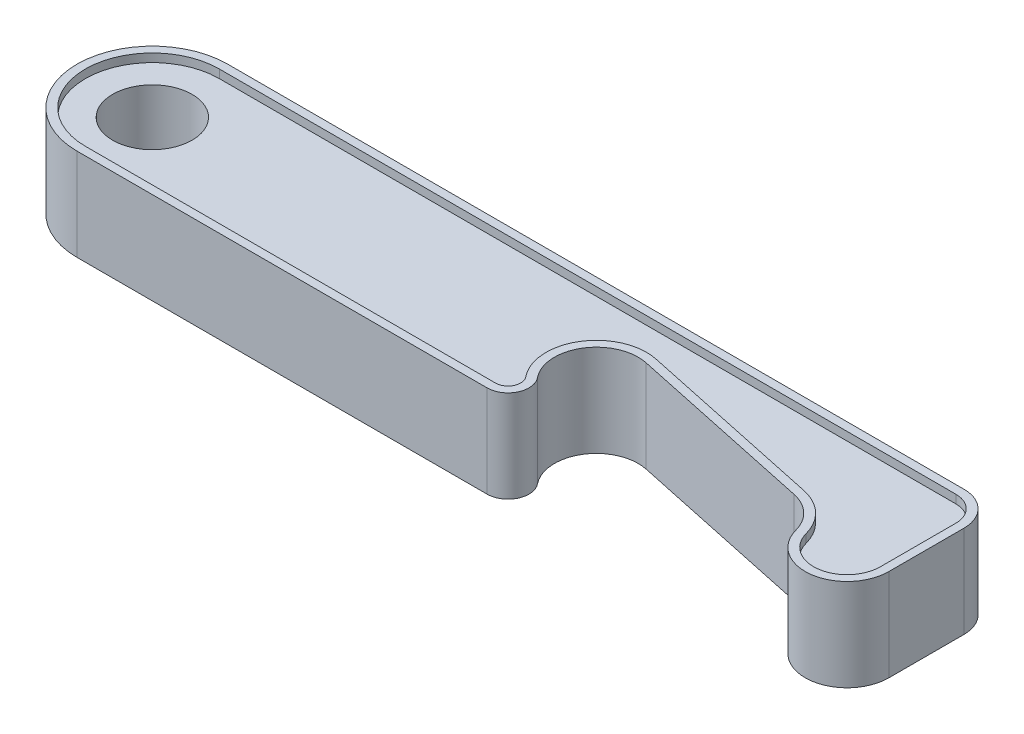
ISO-10303-21;
HEADER;
FILE_DESCRIPTION(('STEP AP214'),'2;1');
FILE_NAME('part.step','',(''),(''),'','','');
FILE_SCHEMA(('AUTOMOTIVE_DESIGN { 1 0 10303 214 1 1 1 1 }'));
ENDSEC;
DATA;
#1=APPLICATION_CONTEXT('core data for automotive mechanical design processes');
#2=APPLICATION_PROTOCOL_DEFINITION('international standard','automotive_design',2000,#1);
#3=PRODUCT_CONTEXT('',#1,'mechanical');
#4=PRODUCT('Part','Part','',(#3));
#5=PRODUCT_RELATED_PRODUCT_CATEGORY('part','',(#4));
#6=PRODUCT_DEFINITION_FORMATION('','',#4);
#7=PRODUCT_DEFINITION_CONTEXT('part definition',#1,'design');
#8=PRODUCT_DEFINITION('design','',#6,#7);
#9=PRODUCT_DEFINITION_SHAPE('','',#8);
#10=(LENGTH_UNIT() NAMED_UNIT(*) SI_UNIT(.MILLI.,.METRE.));
#11=(NAMED_UNIT(*) PLANE_ANGLE_UNIT() SI_UNIT($,.RADIAN.));
#12=(NAMED_UNIT(*) SI_UNIT($,.STERADIAN.) SOLID_ANGLE_UNIT());
#13=UNCERTAINTY_MEASURE_WITH_UNIT(LENGTH_MEASURE(1.E-05),#10,'distance_accuracy_value','');
#14=(GEOMETRIC_REPRESENTATION_CONTEXT(3) GLOBAL_UNCERTAINTY_ASSIGNED_CONTEXT((#13)) GLOBAL_UNIT_ASSIGNED_CONTEXT((#10,
#11,#12)) REPRESENTATION_CONTEXT('',''));
#15=CARTESIAN_POINT('',(0.,0.,0.));
#16=DIRECTION('',(0.,0.,1.));
#17=DIRECTION('',(1.,0.,0.));
#18=AXIS2_PLACEMENT_3D('',#15,#16,#17);
#19=CARTESIAN_POINT('',(0.,4.5,0.));
#20=DIRECTION('',(0.,1.,0.));
#21=DIRECTION('',(0.,0.,1.));
#22=AXIS2_PLACEMENT_3D('',#19,#20,#21);
#23=PLANE('',#22);
#24=CARTESIAN_POINT('',(0.,4.5,0.));
#25=DIRECTION('',(0.,1.,0.));
#26=DIRECTION('',(0.,0.,1.));
#27=AXIS2_PLACEMENT_3D('',#24,#25,#26);
#28=CIRCLE('',#27,4.75);
#29=CARTESIAN_POINT('',(0.,4.5,4.75));
#30=VERTEX_POINT('',#29);
#31=EDGE_CURVE('E352',#30,#30,#28,.T.);
#32=ORIENTED_EDGE('',*,*,#31,.F.);
#33=EDGE_LOOP('',(#32));
#34=FACE_BOUND('',#33,.T.);
#35=CARTESIAN_POINT('',(88.,4.5,-5.));
#36=DIRECTION('',(0.,1.,0.));
#37=DIRECTION('',(0.,0.,1.));
#38=AXIS2_PLACEMENT_3D('',#35,#36,#37);
#39=CIRCLE('',#38,2.99999999999999);
#40=CARTESIAN_POINT('',(91.,4.5,-5.));
#41=VERTEX_POINT('',#40);
#42=CARTESIAN_POINT('',(88.,4.5,-8.));
#43=VERTEX_POINT('',#42);
#44=EDGE_CURVE('E350',#41,#43,#39,.T.);
#45=ORIENTED_EDGE('',*,*,#44,.T.);
#46=DIRECTION('',(-1.,0.,0.));
#47=VECTOR('',#46,1.);
#48=CARTESIAN_POINT('',(0.,4.5,-8.));
#49=LINE('',#48,#47);
#50=CARTESIAN_POINT('',(0.,4.5,-8.));
#51=VERTEX_POINT('',#50);
#52=EDGE_CURVE('E263',#43,#51,#49,.T.);
#53=ORIENTED_EDGE('',*,*,#52,.T.);
#54=CARTESIAN_POINT('',(0.,4.5,0.));
#55=DIRECTION('',(0.,1.,0.));
#56=DIRECTION('',(0.,0.,1.));
#57=AXIS2_PLACEMENT_3D('',#54,#55,#56);
#58=CIRCLE('',#57,8.);
#59=CARTESIAN_POINT('',(0.,4.5,8.));
#60=VERTEX_POINT('',#59);
#61=EDGE_CURVE('E264',#51,#60,#58,.T.);
#62=ORIENTED_EDGE('',*,*,#61,.T.);
#63=DIRECTION('',(1.,0.,0.));
#64=VECTOR('',#63,1.);
#65=CARTESIAN_POINT('',(0.,4.5,8.));
#66=LINE('',#65,#64);
#67=CARTESIAN_POINT('',(49.,4.5,8.));
#68=VERTEX_POINT('',#67);
#69=EDGE_CURVE('E268',#60,#68,#66,.T.);
#70=ORIENTED_EDGE('',*,*,#69,.T.);
#71=CARTESIAN_POINT('',(49.,4.5,6.5));
#72=DIRECTION('',(0.,1.,0.));
#73=DIRECTION('',(0.,0.,1.));
#74=AXIS2_PLACEMENT_3D('',#71,#72,#73);
#75=CIRCLE('',#74,1.5);
#76=CARTESIAN_POINT('',(50.1680412860443,4.5,5.55889450426857));
#77=VERTEX_POINT('',#76);
#78=EDGE_CURVE('E326',#77,#68,#75,.F.);
#79=ORIENTED_EDGE('',*,*,#78,.F.);
#80=CARTESIAN_POINT('',(54.8402064302217,4.5,1.79447252134288));
#81=DIRECTION('',(0.,1.,0.));
#82=DIRECTION('',(0.,0.,1.));
#83=AXIS2_PLACEMENT_3D('',#80,#81,#82);
#84=CIRCLE('',#83,6.);
#85=CARTESIAN_POINT('',(56.0876765751282,4.5,-4.07441308305996));
#86=VERTEX_POINT('',#85);
#87=EDGE_CURVE('E328',#86,#77,#84,.T.);
#88=ORIENTED_EDGE('',*,*,#87,.F.);
#89=DIRECTION('',(-0.978147600733807,0.,-0.207911690817752));
#90=VECTOR('',#89,1.);
#91=CARTESIAN_POINT('',(3.25312375505004,4.5,-15.3047439678686));
#92=LINE('',#91,#90);
#93=CARTESIAN_POINT('',(78.5850713920058,4.5,0.707555805748343));
#94=VERTEX_POINT('',#93);
#95=EDGE_CURVE('E330',#94,#86,#92,.T.);
#96=ORIENTED_EDGE('',*,*,#95,.F.);
#97=CARTESIAN_POINT('',(77.3376012470992,4.5,6.57644141015118));
#98=DIRECTION('',(0.,1.,0.));
#99=DIRECTION('',(0.,0.,1.));
#100=AXIS2_PLACEMENT_3D('',#97,#98,#99);
#101=CIRCLE('',#100,6.);
#102=CARTESIAN_POINT('',(83.1350404988397,4.5,5.03057656406046));
#103=VERTEX_POINT('',#102);
#104=EDGE_CURVE('E422',#103,#94,#101,.T.);
#105=ORIENTED_EDGE('',*,*,#104,.F.);
#106=CARTESIAN_POINT('',(87.,4.5,3.99999999999999));
#107=DIRECTION('',(0.,1.,0.));
#108=DIRECTION('',(0.,0.,1.));
#109=AXIS2_PLACEMENT_3D('',#106,#107,#108);
#110=CIRCLE('',#109,4.);
#111=CARTESIAN_POINT('',(91.,4.5,3.99999999999999));
#112=VERTEX_POINT('',#111);
#113=EDGE_CURVE('E425',#112,#103,#110,.F.);
#114=ORIENTED_EDGE('',*,*,#113,.F.);
#115=DIRECTION('',(0.,0.,1.));
#116=VECTOR('',#115,1.);
#117=CARTESIAN_POINT('',(91.,4.5,-1.40319854501235E-13));
#118=LINE('',#117,#116);
#119=EDGE_CURVE('E426',#41,#112,#118,.T.);
#120=ORIENTED_EDGE('',*,*,#119,.F.);
#121=EDGE_LOOP('',(#45,#53,#62,#70,#79,#88,#96,#105,#114,#120));
#122=FACE_BOUND('',#121,.T.);
#123=ADVANCED_FACE('F41',(#34,#122),#23,.T.);
#124=CARTESIAN_POINT('',(0.,-4.5,0.));
#125=DIRECTION('',(0.,1.,0.));
#126=DIRECTION('',(0.,0.,1.));
#127=AXIS2_PLACEMENT_3D('',#124,#125,#126);
#128=PLANE('',#127);
#129=CARTESIAN_POINT('',(0.,-4.5,0.));
#130=DIRECTION('',(0.,1.,0.));
#131=DIRECTION('',(0.,0.,1.));
#132=AXIS2_PLACEMENT_3D('',#129,#130,#131);
#133=CIRCLE('',#132,4.75);
#134=CARTESIAN_POINT('',(0.,-4.5,4.75));
#135=VERTEX_POINT('',#134);
#136=EDGE_CURVE('E349',#135,#135,#133,.T.);
#137=ORIENTED_EDGE('',*,*,#136,.T.);
#138=EDGE_LOOP('',(#137));
#139=FACE_BOUND('',#138,.T.);
#140=DIRECTION('',(-1.,0.,0.));
#141=VECTOR('',#140,1.);
#142=CARTESIAN_POINT('',(0.,-4.5,-8.));
#143=LINE('',#142,#141);
#144=CARTESIAN_POINT('',(88.,-4.5,-8.));
#145=VERTEX_POINT('',#144);
#146=CARTESIAN_POINT('',(0.,-4.5,-8.));
#147=VERTEX_POINT('',#146);
#148=EDGE_CURVE('E12',#145,#147,#143,.T.);
#149=ORIENTED_EDGE('',*,*,#148,.F.);
#150=CARTESIAN_POINT('',(88.,-4.5,-5.));
#151=DIRECTION('',(0.,1.,0.));
#152=DIRECTION('',(0.,0.,1.));
#153=AXIS2_PLACEMENT_3D('',#150,#151,#152);
#154=CIRCLE('',#153,2.99999999999999);
#155=CARTESIAN_POINT('',(91.,-4.5,-5.));
#156=VERTEX_POINT('',#155);
#157=EDGE_CURVE('E50',#156,#145,#154,.T.);
#158=ORIENTED_EDGE('',*,*,#157,.F.);
#159=DIRECTION('',(0.,0.,1.));
#160=VECTOR('',#159,1.);
#161=CARTESIAN_POINT('',(91.,-4.5,-1.40319854501235E-13));
#162=LINE('',#161,#160);
#163=CARTESIAN_POINT('',(91.,-4.5,3.99999999999999));
#164=VERTEX_POINT('',#163);
#165=EDGE_CURVE('E648',#156,#164,#162,.T.);
#166=ORIENTED_EDGE('',*,*,#165,.T.);
#167=CARTESIAN_POINT('',(87.,-4.5,3.99999999999999));
#168=DIRECTION('',(0.,1.,0.));
#169=DIRECTION('',(0.,0.,1.));
#170=AXIS2_PLACEMENT_3D('',#167,#168,#169);
#171=CIRCLE('',#170,4.);
#172=CARTESIAN_POINT('',(83.1350404988397,-4.5,5.03057656406046));
#173=VERTEX_POINT('',#172);
#174=EDGE_CURVE('E646',#164,#173,#171,.F.);
#175=ORIENTED_EDGE('',*,*,#174,.T.);
#176=CARTESIAN_POINT('',(77.3376012470992,-4.5,6.57644141015118));
#177=DIRECTION('',(0.,1.,0.));
#178=DIRECTION('',(0.,0.,1.));
#179=AXIS2_PLACEMENT_3D('',#176,#177,#178);
#180=CIRCLE('',#179,6.);
#181=CARTESIAN_POINT('',(78.5850713920058,-4.5,0.707555805748343));
#182=VERTEX_POINT('',#181);
#183=EDGE_CURVE('E374',#173,#182,#180,.T.);
#184=ORIENTED_EDGE('',*,*,#183,.T.);
#185=DIRECTION('',(-0.978147600733807,0.,-0.207911690817752));
#186=VECTOR('',#185,1.);
#187=CARTESIAN_POINT('',(3.25312375505004,-4.5,-15.3047439678686));
#188=LINE('',#187,#186);
#189=CARTESIAN_POINT('',(56.0876765751282,-4.5,-4.07441308305996));
#190=VERTEX_POINT('',#189);
#191=EDGE_CURVE('E369',#182,#190,#188,.T.);
#192=ORIENTED_EDGE('',*,*,#191,.T.);
#193=CARTESIAN_POINT('',(54.8402064302217,-4.5,1.79447252134288));
#194=DIRECTION('',(0.,1.,0.));
#195=DIRECTION('',(0.,0.,1.));
#196=AXIS2_PLACEMENT_3D('',#193,#194,#195);
#197=CIRCLE('',#196,6.);
#198=CARTESIAN_POINT('',(50.1680412860443,-4.5,5.55889450426857));
#199=VERTEX_POINT('',#198);
#200=EDGE_CURVE('E365',#190,#199,#197,.T.);
#201=ORIENTED_EDGE('',*,*,#200,.T.);
#202=CARTESIAN_POINT('',(49.,-4.5,6.5));
#203=DIRECTION('',(0.,1.,0.));
#204=DIRECTION('',(0.,0.,1.));
#205=AXIS2_PLACEMENT_3D('',#202,#203,#204);
#206=CIRCLE('',#205,1.5);
#207=CARTESIAN_POINT('',(49.,-4.5,8.));
#208=VERTEX_POINT('',#207);
#209=EDGE_CURVE('E370',#199,#208,#206,.F.);
#210=ORIENTED_EDGE('',*,*,#209,.T.);
#211=DIRECTION('',(1.,0.,0.));
#212=VECTOR('',#211,1.);
#213=CARTESIAN_POINT('',(0.,-4.5,8.));
#214=LINE('',#213,#212);
#215=CARTESIAN_POINT('',(0.,-4.5,8.));
#216=VERTEX_POINT('',#215);
#217=EDGE_CURVE('E384',#216,#208,#214,.T.);
#218=ORIENTED_EDGE('',*,*,#217,.F.);
#219=CARTESIAN_POINT('',(0.,-4.5,0.));
#220=DIRECTION('',(0.,1.,0.));
#221=DIRECTION('',(0.,0.,1.));
#222=AXIS2_PLACEMENT_3D('',#219,#220,#221);
#223=CIRCLE('',#222,8.);
#224=EDGE_CURVE('E387',#147,#216,#223,.T.);
#225=ORIENTED_EDGE('',*,*,#224,.F.);
#226=EDGE_LOOP('',(#149,#158,#166,#175,#184,#192,#201,#210,#218,#225));
#227=FACE_BOUND('',#226,.T.);
#228=ADVANCED_FACE('F660',(#139,#227),#128,.F.);
#229=CARTESIAN_POINT('',(0.,4.5,0.));
#230=DIRECTION('',(0.,-1.,0.));
#231=DIRECTION('',(0.,0.,-1.));
#232=AXIS2_PLACEMENT_3D('',#229,#230,#231);
#233=CYLINDRICAL_SURFACE('',#232,4.75);
#234=ORIENTED_EDGE('',*,*,#31,.T.);
#235=EDGE_LOOP('',(#234));
#236=FACE_BOUND('',#235,.T.);
#237=ORIENTED_EDGE('',*,*,#136,.F.);
#238=EDGE_LOOP('',(#237));
#239=FACE_BOUND('',#238,.T.);
#240=ADVANCED_FACE('F43',(#236,#239),#233,.F.);
#241=CARTESIAN_POINT('',(0.,5.5,0.));
#242=DIRECTION('',(0.,-1.,0.));
#243=DIRECTION('',(0.,0.,-1.));
#244=AXIS2_PLACEMENT_3D('',#241,#242,#243);
#245=CYLINDRICAL_SURFACE('',#244,8.);
#246=DIRECTION('',(0.,-1.,0.));
#247=VECTOR('',#246,1.);
#248=CARTESIAN_POINT('',(0.,5.5,-8.));
#249=LINE('',#248,#247);
#250=CARTESIAN_POINT('',(0.,-5.5,-8.));
#251=VERTEX_POINT('',#250);
#252=EDGE_CURVE('E293',#147,#251,#249,.T.);
#253=ORIENTED_EDGE('',*,*,#252,.F.);
#254=ORIENTED_EDGE('',*,*,#224,.T.);
#255=DIRECTION('',(0.,-1.,0.));
#256=VECTOR('',#255,1.);
#257=CARTESIAN_POINT('',(0.,5.5,8.));
#258=LINE('',#257,#256);
#259=CARTESIAN_POINT('',(0.,-5.5,8.));
#260=VERTEX_POINT('',#259);
#261=EDGE_CURVE('E292',#216,#260,#258,.T.);
#262=ORIENTED_EDGE('',*,*,#261,.T.);
#263=CARTESIAN_POINT('',(0.,-5.5,0.));
#264=DIRECTION('',(0.,1.,0.));
#265=DIRECTION('',(0.,0.,1.));
#266=AXIS2_PLACEMENT_3D('',#263,#264,#265);
#267=CIRCLE('',#266,8.);
#268=EDGE_CURVE('E406',#260,#251,#267,.F.);
#269=ORIENTED_EDGE('',*,*,#268,.T.);
#270=EDGE_LOOP('',(#253,#254,#262,#269));
#271=FACE_BOUND('',#270,.T.);
#272=ADVANCED_FACE('F614',(#271),#245,.F.);
#273=CARTESIAN_POINT('',(0.,5.5,8.));
#274=DIRECTION('',(0.,0.,1.));
#275=DIRECTION('',(1.,0.,0.));
#276=AXIS2_PLACEMENT_3D('',#273,#274,#275);
#277=PLANE('',#276);
#278=ORIENTED_EDGE('',*,*,#261,.F.);
#279=ORIENTED_EDGE('',*,*,#217,.T.);
#280=DIRECTION('',(0.,-1.,0.));
#281=VECTOR('',#280,1.);
#282=CARTESIAN_POINT('',(49.,5.5,8.));
#283=LINE('',#282,#281);
#284=CARTESIAN_POINT('',(49.,-5.5,8.));
#285=VERTEX_POINT('',#284);
#286=EDGE_CURVE('E623',#208,#285,#283,.T.);
#287=ORIENTED_EDGE('',*,*,#286,.T.);
#288=DIRECTION('',(-1.,0.,0.));
#289=VECTOR('',#288,1.);
#290=CARTESIAN_POINT('',(0.,-5.5,8.));
#291=LINE('',#290,#289);
#292=EDGE_CURVE('E579',#285,#260,#291,.T.);
#293=ORIENTED_EDGE('',*,*,#292,.T.);
#294=EDGE_LOOP('',(#278,#279,#287,#293));
#295=FACE_BOUND('',#294,.T.);
#296=ADVANCED_FACE('F764',(#295),#277,.F.);
#297=CARTESIAN_POINT('',(49.,5.5,6.5));
#298=DIRECTION('',(0.,-1.,0.));
#299=DIRECTION('',(0.,0.,-1.));
#300=AXIS2_PLACEMENT_3D('',#297,#298,#299);
#301=CYLINDRICAL_SURFACE('',#300,1.5);
#302=ORIENTED_EDGE('',*,*,#209,.F.);
#303=DIRECTION('',(0.,-1.,0.));
#304=VECTOR('',#303,1.);
#305=CARTESIAN_POINT('',(50.1680412860443,5.5,5.55889450426857));
#306=LINE('',#305,#304);
#307=CARTESIAN_POINT('',(50.1680412860443,-5.5,5.55889450426857));
#308=VERTEX_POINT('',#307);
#309=EDGE_CURVE('E338',#199,#308,#306,.T.);
#310=ORIENTED_EDGE('',*,*,#309,.T.);
#311=CARTESIAN_POINT('',(49.,-5.5,6.5));
#312=DIRECTION('',(0.,1.,0.));
#313=DIRECTION('',(0.,0.,1.));
#314=AXIS2_PLACEMENT_3D('',#311,#312,#313);
#315=CIRCLE('',#314,1.5);
#316=EDGE_CURVE('E582',#285,#308,#315,.T.);
#317=ORIENTED_EDGE('',*,*,#316,.F.);
#318=ORIENTED_EDGE('',*,*,#286,.F.);
#319=EDGE_LOOP('',(#302,#310,#317,#318));
#320=FACE_BOUND('',#319,.T.);
#321=ADVANCED_FACE('F622',(#320),#301,.F.);
#322=CARTESIAN_POINT('',(54.8402064302217,5.5,1.79447252134288));
#323=DIRECTION('',(0.,-1.,0.));
#324=DIRECTION('',(0.,0.,-1.));
#325=AXIS2_PLACEMENT_3D('',#322,#323,#324);
#326=CYLINDRICAL_SURFACE('',#325,6.);
#327=ORIENTED_EDGE('',*,*,#200,.F.);
#328=DIRECTION('',(0.,-1.,0.));
#329=VECTOR('',#328,1.);
#330=CARTESIAN_POINT('',(56.0876765751282,5.5,-4.07441308305996));
#331=LINE('',#330,#329);
#332=CARTESIAN_POINT('',(56.0876765751282,-5.5,-4.07441308305996));
#333=VERTEX_POINT('',#332);
#334=EDGE_CURVE('E337',#190,#333,#331,.T.);
#335=ORIENTED_EDGE('',*,*,#334,.T.);
#336=CARTESIAN_POINT('',(54.8402064302217,-5.5,1.79447252134288));
#337=DIRECTION('',(0.,1.,0.));
#338=DIRECTION('',(0.,0.,1.));
#339=AXIS2_PLACEMENT_3D('',#336,#337,#338);
#340=CIRCLE('',#339,6.);
#341=EDGE_CURVE('E586',#308,#333,#340,.F.);
#342=ORIENTED_EDGE('',*,*,#341,.F.);
#343=ORIENTED_EDGE('',*,*,#309,.F.);
#344=EDGE_LOOP('',(#327,#335,#342,#343));
#345=FACE_BOUND('',#344,.T.);
#346=ADVANCED_FACE('F628',(#345),#326,.T.);
#347=CARTESIAN_POINT('',(3.25312375505004,5.5,-15.3047439678686));
#348=DIRECTION('',(0.207911690817752,0.,-0.978147600733807));
#349=DIRECTION('',(-0.978147600733807,0.,-0.207911690817752));
#350=AXIS2_PLACEMENT_3D('',#347,#348,#349);
#351=PLANE('',#350);
#352=ORIENTED_EDGE('',*,*,#191,.F.);
#353=DIRECTION('',(0.,-1.,0.));
#354=VECTOR('',#353,1.);
#355=CARTESIAN_POINT('',(78.5850713920058,5.5,0.707555805748343));
#356=LINE('',#355,#354);
#357=CARTESIAN_POINT('',(78.5850713920058,-5.5,0.707555805748343));
#358=VERTEX_POINT('',#357);
#359=EDGE_CURVE('E312',#182,#358,#356,.T.);
#360=ORIENTED_EDGE('',*,*,#359,.T.);
#361=DIRECTION('',(0.978147600733807,0.,0.207911690817752));
#362=VECTOR('',#361,1.);
#363=CARTESIAN_POINT('',(3.25312375505004,-5.5,-15.3047439678686));
#364=LINE('',#363,#362);
#365=EDGE_CURVE('E589',#333,#358,#364,.T.);
#366=ORIENTED_EDGE('',*,*,#365,.F.);
#367=ORIENTED_EDGE('',*,*,#334,.F.);
#368=EDGE_LOOP('',(#352,#360,#366,#367));
#369=FACE_BOUND('',#368,.T.);
#370=ADVANCED_FACE('F635',(#369),#351,.T.);
#371=CARTESIAN_POINT('',(77.3376012470992,5.5,6.57644141015118));
#372=DIRECTION('',(0.,-1.,0.));
#373=DIRECTION('',(0.,0.,-1.));
#374=AXIS2_PLACEMENT_3D('',#371,#372,#373);
#375=CYLINDRICAL_SURFACE('',#374,6.);
#376=ORIENTED_EDGE('',*,*,#183,.F.);
#377=DIRECTION('',(0.,-1.,0.));
#378=VECTOR('',#377,1.);
#379=CARTESIAN_POINT('',(83.1350404988397,5.5,5.03057656406046));
#380=LINE('',#379,#378);
#381=CARTESIAN_POINT('',(83.1350404988397,-5.5,5.03057656406046));
#382=VERTEX_POINT('',#381);
#383=EDGE_CURVE('E311',#173,#382,#380,.T.);
#384=ORIENTED_EDGE('',*,*,#383,.T.);
#385=CARTESIAN_POINT('',(77.3376012470992,-5.5,6.57644141015118));
#386=DIRECTION('',(0.,1.,0.));
#387=DIRECTION('',(0.,0.,1.));
#388=AXIS2_PLACEMENT_3D('',#385,#386,#387);
#389=CIRCLE('',#388,6.);
#390=EDGE_CURVE('E593',#358,#382,#389,.F.);
#391=ORIENTED_EDGE('',*,*,#390,.F.);
#392=ORIENTED_EDGE('',*,*,#359,.F.);
#393=EDGE_LOOP('',(#376,#384,#391,#392));
#394=FACE_BOUND('',#393,.T.);
#395=ADVANCED_FACE('F639',(#394),#375,.T.);
#396=CARTESIAN_POINT('',(87.,5.5,3.99999999999999));
#397=DIRECTION('',(0.,-1.,0.));
#398=DIRECTION('',(0.,0.,-1.));
#399=AXIS2_PLACEMENT_3D('',#396,#397,#398);
#400=CYLINDRICAL_SURFACE('',#399,4.);
#401=ORIENTED_EDGE('',*,*,#174,.F.);
#402=DIRECTION('',(0.,-1.,0.));
#403=VECTOR('',#402,1.);
#404=CARTESIAN_POINT('',(91.,5.5,3.99999999999999));
#405=LINE('',#404,#403);
#406=CARTESIAN_POINT('',(91.,-5.5,3.99999999999999));
#407=VERTEX_POINT('',#406);
#408=EDGE_CURVE('E441',#164,#407,#405,.T.);
#409=ORIENTED_EDGE('',*,*,#408,.T.);
#410=CARTESIAN_POINT('',(87.,-5.5,3.99999999999999));
#411=DIRECTION('',(0.,1.,0.));
#412=DIRECTION('',(0.,0.,1.));
#413=AXIS2_PLACEMENT_3D('',#410,#411,#412);
#414=CIRCLE('',#413,4.);
#415=EDGE_CURVE('E596',#382,#407,#414,.T.);
#416=ORIENTED_EDGE('',*,*,#415,.F.);
#417=ORIENTED_EDGE('',*,*,#383,.F.);
#418=EDGE_LOOP('',(#401,#409,#416,#417));
#419=FACE_BOUND('',#418,.T.);
#420=ADVANCED_FACE('F644',(#419),#400,.F.);
#421=CARTESIAN_POINT('',(91.,5.5,-1.40319854501235E-13));
#422=DIRECTION('',(-1.,0.,0.));
#423=DIRECTION('',(0.,0.,1.));
#424=AXIS2_PLACEMENT_3D('',#421,#422,#423);
#425=PLANE('',#424);
#426=ORIENTED_EDGE('',*,*,#165,.F.);
#427=DIRECTION('',(0.,-1.,0.));
#428=VECTOR('',#427,1.);
#429=CARTESIAN_POINT('',(91.,5.5,-5.));
#430=LINE('',#429,#428);
#431=CARTESIAN_POINT('',(91.,-5.5,-5.));
#432=VERTEX_POINT('',#431);
#433=EDGE_CURVE('E434',#156,#432,#430,.T.);
#434=ORIENTED_EDGE('',*,*,#433,.T.);
#435=DIRECTION('',(0.,0.,-1.));
#436=VECTOR('',#435,1.);
#437=CARTESIAN_POINT('',(91.,-5.5,-1.40319854501235E-13));
#438=LINE('',#437,#436);
#439=EDGE_CURVE('E599',#407,#432,#438,.T.);
#440=ORIENTED_EDGE('',*,*,#439,.F.);
#441=ORIENTED_EDGE('',*,*,#408,.F.);
#442=EDGE_LOOP('',(#426,#434,#440,#441));
#443=FACE_BOUND('',#442,.T.);
#444=ADVANCED_FACE('F647',(#443),#425,.T.);
#445=CARTESIAN_POINT('',(88.,5.5,-5.));
#446=DIRECTION('',(0.,-1.,0.));
#447=DIRECTION('',(0.,0.,-1.));
#448=AXIS2_PLACEMENT_3D('',#445,#446,#447);
#449=CYLINDRICAL_SURFACE('',#448,2.99999999999999);
#450=ORIENTED_EDGE('',*,*,#433,.F.);
#451=ORIENTED_EDGE('',*,*,#157,.T.);
#452=DIRECTION('',(0.,-1.,0.));
#453=VECTOR('',#452,1.);
#454=CARTESIAN_POINT('',(88.,5.5,-8.));
#455=LINE('',#454,#453);
#456=CARTESIAN_POINT('',(88.,-5.5,-8.));
#457=VERTEX_POINT('',#456);
#458=EDGE_CURVE('E265',#145,#457,#455,.T.);
#459=ORIENTED_EDGE('',*,*,#458,.T.);
#460=CARTESIAN_POINT('',(88.,-5.5,-5.));
#461=DIRECTION('',(0.,1.,0.));
#462=DIRECTION('',(0.,0.,1.));
#463=AXIS2_PLACEMENT_3D('',#460,#461,#462);
#464=CIRCLE('',#463,2.99999999999999);
#465=EDGE_CURVE('E573',#457,#432,#464,.F.);
#466=ORIENTED_EDGE('',*,*,#465,.T.);
#467=EDGE_LOOP('',(#450,#451,#459,#466));
#468=FACE_BOUND('',#467,.T.);
#469=ADVANCED_FACE('F605',(#468),#449,.F.);
#470=CARTESIAN_POINT('',(0.,5.5,-8.));
#471=DIRECTION('',(0.,0.,-1.));
#472=DIRECTION('',(-1.,0.,0.));
#473=AXIS2_PLACEMENT_3D('',#470,#471,#472);
#474=PLANE('',#473);
#475=ORIENTED_EDGE('',*,*,#458,.F.);
#476=ORIENTED_EDGE('',*,*,#148,.T.);
#477=ORIENTED_EDGE('',*,*,#252,.T.);
#478=DIRECTION('',(1.,0.,0.));
#479=VECTOR('',#478,1.);
#480=CARTESIAN_POINT('',(0.,-5.5,-8.));
#481=LINE('',#480,#479);
#482=EDGE_CURVE('E569',#251,#457,#481,.T.);
#483=ORIENTED_EDGE('',*,*,#482,.T.);
#484=EDGE_LOOP('',(#475,#476,#477,#483));
#485=FACE_BOUND('',#484,.T.);
#486=ADVANCED_FACE('F610',(#485),#474,.F.);
#487=CARTESIAN_POINT('',(0.,-5.5,0.));
#488=DIRECTION('',(0.,1.,0.));
#489=DIRECTION('',(0.,0.,1.));
#490=AXIS2_PLACEMENT_3D('',#487,#488,#489);
#491=PLANE('',#490);
#492=ORIENTED_EDGE('',*,*,#482,.F.);
#493=ORIENTED_EDGE('',*,*,#268,.F.);
#494=ORIENTED_EDGE('',*,*,#292,.F.);
#495=ORIENTED_EDGE('',*,*,#316,.T.);
#496=ORIENTED_EDGE('',*,*,#341,.T.);
#497=ORIENTED_EDGE('',*,*,#365,.T.);
#498=ORIENTED_EDGE('',*,*,#390,.T.);
#499=ORIENTED_EDGE('',*,*,#415,.T.);
#500=ORIENTED_EDGE('',*,*,#439,.T.);
#501=ORIENTED_EDGE('',*,*,#465,.F.);
#502=EDGE_LOOP('',(#492,#493,#494,#495,#496,#497,#498,#499,#500,#501));
#503=FACE_BOUND('',#502,.T.);
#504=DIRECTION('',(0.,0.,-1.));
#505=VECTOR('',#504,1.);
#506=CARTESIAN_POINT('',(92.,-5.5,0.));
#507=LINE('',#506,#505);
#508=CARTESIAN_POINT('',(92.,-5.5,3.99999999999999));
#509=VERTEX_POINT('',#508);
#510=CARTESIAN_POINT('',(92.,-5.5,-5.));
#511=VERTEX_POINT('',#510);
#512=EDGE_CURVE('E400',#509,#511,#507,.T.);
#513=ORIENTED_EDGE('',*,*,#512,.F.);
#514=CARTESIAN_POINT('',(87.,-5.5,3.99999999999999));
#515=DIRECTION('',(0.,1.,0.));
#516=DIRECTION('',(0.,0.,1.));
#517=AXIS2_PLACEMENT_3D('',#514,#515,#516);
#518=CIRCLE('',#517,5.);
#519=CARTESIAN_POINT('',(82.1688006235496,-5.5,5.28822070507559));
#520=VERTEX_POINT('',#519);
#521=EDGE_CURVE('E259',#520,#509,#518,.T.);
#522=ORIENTED_EDGE('',*,*,#521,.F.);
#523=CARTESIAN_POINT('',(77.3376012470992,-5.5,6.57644141015118));
#524=DIRECTION('',(0.,1.,0.));
#525=DIRECTION('',(0.,0.,1.));
#526=AXIS2_PLACEMENT_3D('',#523,#524,#525);
#527=CIRCLE('',#526,5.);
#528=CARTESIAN_POINT('',(78.377159701188,-5.5,1.68570340648215));
#529=VERTEX_POINT('',#528);
#530=EDGE_CURVE('E510',#529,#520,#527,.F.);
#531=ORIENTED_EDGE('',*,*,#530,.F.);
#532=DIRECTION('',(0.978147600733807,0.,0.207911690817753));
#533=VECTOR('',#532,1.);
#534=CARTESIAN_POINT('',(3.04521206423229,-5.5,-14.3265963671348));
#535=LINE('',#534,#533);
#536=CARTESIAN_POINT('',(55.8797648843104,-5.5,-3.09626548232616));
#537=VERTEX_POINT('',#536);
#538=EDGE_CURVE('E507',#537,#529,#535,.T.);
#539=ORIENTED_EDGE('',*,*,#538,.F.);
#540=CARTESIAN_POINT('',(54.8402064302217,-5.5,1.79447252134288));
#541=DIRECTION('',(0.,1.,0.));
#542=DIRECTION('',(0.,0.,1.));
#543=AXIS2_PLACEMENT_3D('',#540,#541,#542);
#544=CIRCLE('',#543,5.);
#545=CARTESIAN_POINT('',(50.9467354767406,-5.5,4.93149084044763));
#546=VERTEX_POINT('',#545);
#547=EDGE_CURVE('E511',#546,#537,#544,.F.);
#548=ORIENTED_EDGE('',*,*,#547,.F.);
#549=CARTESIAN_POINT('',(49.,-5.5,6.5));
#550=DIRECTION('',(0.,1.,0.));
#551=DIRECTION('',(0.,0.,1.));
#552=AXIS2_PLACEMENT_3D('',#549,#550,#551);
#553=CIRCLE('',#552,2.5);
#554=CARTESIAN_POINT('',(49.,-5.5,8.99999999999999));
#555=VERTEX_POINT('',#554);
#556=EDGE_CURVE('E496',#555,#546,#553,.T.);
#557=ORIENTED_EDGE('',*,*,#556,.F.);
#558=DIRECTION('',(-1.,0.,0.));
#559=VECTOR('',#558,1.);
#560=CARTESIAN_POINT('',(0.,-5.5,9.));
#561=LINE('',#560,#559);
#562=CARTESIAN_POINT('',(0.,-5.5,9.));
#563=VERTEX_POINT('',#562);
#564=EDGE_CURVE('E495',#555,#563,#561,.T.);
#565=ORIENTED_EDGE('',*,*,#564,.T.);
#566=CARTESIAN_POINT('',(0.,-5.5,0.));
#567=DIRECTION('',(0.,1.,0.));
#568=DIRECTION('',(0.,0.,1.));
#569=AXIS2_PLACEMENT_3D('',#566,#567,#568);
#570=CIRCLE('',#569,9.);
#571=CARTESIAN_POINT('',(0.,-5.5,-9.00000000000001));
#572=VERTEX_POINT('',#571);
#573=EDGE_CURVE('E494',#563,#572,#570,.F.);
#574=ORIENTED_EDGE('',*,*,#573,.T.);
#575=DIRECTION('',(1.,0.,0.));
#576=VECTOR('',#575,1.);
#577=CARTESIAN_POINT('',(0.,-5.5,-9.00000000000001));
#578=LINE('',#577,#576);
#579=CARTESIAN_POINT('',(88.,-5.5,-9.00000000000001));
#580=VERTEX_POINT('',#579);
#581=EDGE_CURVE('E411',#572,#580,#578,.T.);
#582=ORIENTED_EDGE('',*,*,#581,.T.);
#583=CARTESIAN_POINT('',(88.,-5.5,-5.));
#584=DIRECTION('',(0.,1.,0.));
#585=DIRECTION('',(0.,0.,1.));
#586=AXIS2_PLACEMENT_3D('',#583,#584,#585);
#587=CIRCLE('',#586,4.);
#588=EDGE_CURVE('E405',#511,#580,#587,.T.);
#589=ORIENTED_EDGE('',*,*,#588,.F.);
#590=EDGE_LOOP('',(#513,#522,#531,#539,#548,#557,#565,#574,#582,#589));
#591=FACE_BOUND('',#590,.T.);
#592=ADVANCED_FACE('F492',(#503,#591),#491,.F.);
#593=ORIENTED_EDGE('',*,*,#52,.F.);
#594=CARTESIAN_POINT('',(88.,5.5,-8.));
#595=VERTEX_POINT('',#594);
#596=EDGE_CURVE('E242',#595,#43,#455,.T.);
#597=ORIENTED_EDGE('',*,*,#596,.F.);
#598=DIRECTION('',(1.,0.,0.));
#599=VECTOR('',#598,1.);
#600=CARTESIAN_POINT('',(0.,5.5,-8.));
#601=LINE('',#600,#599);
#602=CARTESIAN_POINT('',(0.,5.5,-8.));
#603=VERTEX_POINT('',#602);
#604=EDGE_CURVE('E250',#603,#595,#601,.T.);
#605=ORIENTED_EDGE('',*,*,#604,.F.);
#606=EDGE_CURVE('E289',#603,#51,#249,.T.);
#607=ORIENTED_EDGE('',*,*,#606,.T.);
#608=EDGE_LOOP('',(#593,#597,#605,#607));
#609=FACE_BOUND('',#608,.T.);
#610=ADVANCED_FACE('F261',(#609),#474,.F.);
#611=ORIENTED_EDGE('',*,*,#44,.F.);
#612=CARTESIAN_POINT('',(91.,5.5,-5.));
#613=VERTEX_POINT('',#612);
#614=EDGE_CURVE('E245',#613,#41,#430,.T.);
#615=ORIENTED_EDGE('',*,*,#614,.F.);
#616=CARTESIAN_POINT('',(88.,5.5,-5.));
#617=DIRECTION('',(0.,1.,0.));
#618=DIRECTION('',(0.,0.,1.));
#619=AXIS2_PLACEMENT_3D('',#616,#617,#618);
#620=CIRCLE('',#619,2.99999999999999);
#621=EDGE_CURVE('E238',#595,#613,#620,.F.);
#622=ORIENTED_EDGE('',*,*,#621,.F.);
#623=ORIENTED_EDGE('',*,*,#596,.T.);
#624=EDGE_LOOP('',(#611,#615,#622,#623));
#625=FACE_BOUND('',#624,.T.);
#626=ADVANCED_FACE('F240',(#625),#449,.F.);
#627=ORIENTED_EDGE('',*,*,#614,.T.);
#628=ORIENTED_EDGE('',*,*,#119,.T.);
#629=CARTESIAN_POINT('',(91.,5.5,3.99999999999999));
#630=VERTEX_POINT('',#629);
#631=EDGE_CURVE('E435',#630,#112,#405,.T.);
#632=ORIENTED_EDGE('',*,*,#631,.F.);
#633=DIRECTION('',(0.,0.,-1.));
#634=VECTOR('',#633,1.);
#635=CARTESIAN_POINT('',(91.,5.5,-1.40319854501235E-13));
#636=LINE('',#635,#634);
#637=EDGE_CURVE('E249',#630,#613,#636,.T.);
#638=ORIENTED_EDGE('',*,*,#637,.T.);
#639=EDGE_LOOP('',(#627,#628,#632,#638));
#640=FACE_BOUND('',#639,.T.);
#641=ADVANCED_FACE('F433',(#640),#425,.T.);
#642=ORIENTED_EDGE('',*,*,#631,.T.);
#643=ORIENTED_EDGE('',*,*,#113,.T.);
#644=CARTESIAN_POINT('',(83.1350404988397,5.5,5.03057656406046));
#645=VERTEX_POINT('',#644);
#646=EDGE_CURVE('E316',#645,#103,#380,.T.);
#647=ORIENTED_EDGE('',*,*,#646,.F.);
#648=CARTESIAN_POINT('',(87.,5.5,3.99999999999999));
#649=DIRECTION('',(0.,1.,0.));
#650=DIRECTION('',(0.,0.,1.));
#651=AXIS2_PLACEMENT_3D('',#648,#649,#650);
#652=CIRCLE('',#651,4.);
#653=EDGE_CURVE('E1079',#645,#630,#652,.T.);
#654=ORIENTED_EDGE('',*,*,#653,.T.);
#655=EDGE_LOOP('',(#642,#643,#647,#654));
#656=FACE_BOUND('',#655,.T.);
#657=ADVANCED_FACE('F657',(#656),#400,.F.);
#658=ORIENTED_EDGE('',*,*,#646,.T.);
#659=ORIENTED_EDGE('',*,*,#104,.T.);
#660=CARTESIAN_POINT('',(78.5850713920058,5.5,0.707555805748343));
#661=VERTEX_POINT('',#660);
#662=EDGE_CURVE('E306',#661,#94,#356,.T.);
#663=ORIENTED_EDGE('',*,*,#662,.F.);
#664=CARTESIAN_POINT('',(77.3376012470992,5.5,6.57644141015118));
#665=DIRECTION('',(0.,1.,0.));
#666=DIRECTION('',(0.,0.,1.));
#667=AXIS2_PLACEMENT_3D('',#664,#665,#666);
#668=CIRCLE('',#667,6.);
#669=EDGE_CURVE('E1068',#661,#645,#668,.F.);
#670=ORIENTED_EDGE('',*,*,#669,.T.);
#671=EDGE_LOOP('',(#658,#659,#663,#670));
#672=FACE_BOUND('',#671,.T.);
#673=ADVANCED_FACE('F789',(#672),#375,.T.);
#674=ORIENTED_EDGE('',*,*,#662,.T.);
#675=ORIENTED_EDGE('',*,*,#95,.T.);
#676=CARTESIAN_POINT('',(56.0876765751282,5.5,-4.07441308305996));
#677=VERTEX_POINT('',#676);
#678=EDGE_CURVE('E313',#677,#86,#331,.T.);
#679=ORIENTED_EDGE('',*,*,#678,.F.);
#680=DIRECTION('',(0.978147600733807,0.,0.207911690817752));
#681=VECTOR('',#680,1.);
#682=CARTESIAN_POINT('',(3.25312375505004,5.5,-15.3047439678686));
#683=LINE('',#682,#681);
#684=EDGE_CURVE('E1065',#677,#661,#683,.T.);
#685=ORIENTED_EDGE('',*,*,#684,.T.);
#686=EDGE_LOOP('',(#674,#675,#679,#685));
#687=FACE_BOUND('',#686,.T.);
#688=ADVANCED_FACE('F781',(#687),#351,.T.);
#689=ORIENTED_EDGE('',*,*,#678,.T.);
#690=ORIENTED_EDGE('',*,*,#87,.T.);
#691=CARTESIAN_POINT('',(50.1680412860443,5.5,5.55889450426857));
#692=VERTEX_POINT('',#691);
#693=EDGE_CURVE('E334',#692,#77,#306,.T.);
#694=ORIENTED_EDGE('',*,*,#693,.F.);
#695=CARTESIAN_POINT('',(54.8402064302217,5.5,1.79447252134288));
#696=DIRECTION('',(0.,1.,0.));
#697=DIRECTION('',(0.,0.,1.));
#698=AXIS2_PLACEMENT_3D('',#695,#696,#697);
#699=CIRCLE('',#698,6.);
#700=EDGE_CURVE('E1061',#692,#677,#699,.F.);
#701=ORIENTED_EDGE('',*,*,#700,.T.);
#702=EDGE_LOOP('',(#689,#690,#694,#701));
#703=FACE_BOUND('',#702,.T.);
#704=ADVANCED_FACE('F771',(#703),#326,.T.);
#705=ORIENTED_EDGE('',*,*,#693,.T.);
#706=ORIENTED_EDGE('',*,*,#78,.T.);
#707=CARTESIAN_POINT('',(49.,5.5,8.));
#708=VERTEX_POINT('',#707);
#709=EDGE_CURVE('E339',#708,#68,#283,.T.);
#710=ORIENTED_EDGE('',*,*,#709,.F.);
#711=CARTESIAN_POINT('',(49.,5.5,6.5));
#712=DIRECTION('',(0.,1.,0.));
#713=DIRECTION('',(0.,0.,1.));
#714=AXIS2_PLACEMENT_3D('',#711,#712,#713);
#715=CIRCLE('',#714,1.5);
#716=EDGE_CURVE('E1057',#708,#692,#715,.T.);
#717=ORIENTED_EDGE('',*,*,#716,.T.);
#718=EDGE_LOOP('',(#705,#706,#710,#717));
#719=FACE_BOUND('',#718,.T.);
#720=ADVANCED_FACE('F761',(#719),#301,.F.);
#721=ORIENTED_EDGE('',*,*,#69,.F.);
#722=CARTESIAN_POINT('',(0.,5.5,8.));
#723=VERTEX_POINT('',#722);
#724=EDGE_CURVE('E57',#723,#60,#258,.T.);
#725=ORIENTED_EDGE('',*,*,#724,.F.);
#726=DIRECTION('',(-1.,0.,0.));
#727=VECTOR('',#726,1.);
#728=CARTESIAN_POINT('',(0.,5.5,8.));
#729=LINE('',#728,#727);
#730=EDGE_CURVE('E529',#708,#723,#729,.T.);
#731=ORIENTED_EDGE('',*,*,#730,.F.);
#732=ORIENTED_EDGE('',*,*,#709,.T.);
#733=EDGE_LOOP('',(#721,#725,#731,#732));
#734=FACE_BOUND('',#733,.T.);
#735=ADVANCED_FACE('F752',(#734),#277,.F.);
#736=ORIENTED_EDGE('',*,*,#61,.F.);
#737=ORIENTED_EDGE('',*,*,#606,.F.);
#738=CARTESIAN_POINT('',(0.,5.5,0.));
#739=DIRECTION('',(0.,1.,0.));
#740=DIRECTION('',(0.,0.,1.));
#741=AXIS2_PLACEMENT_3D('',#738,#739,#740);
#742=CIRCLE('',#741,8.);
#743=EDGE_CURVE('E255',#723,#603,#742,.F.);
#744=ORIENTED_EDGE('',*,*,#743,.F.);
#745=ORIENTED_EDGE('',*,*,#724,.T.);
#746=EDGE_LOOP('',(#736,#737,#744,#745));
#747=FACE_BOUND('',#746,.T.);
#748=ADVANCED_FACE('F743',(#747),#245,.F.);
#749=CARTESIAN_POINT('',(0.,5.5,0.));
#750=DIRECTION('',(0.,1.,0.));
#751=DIRECTION('',(0.,0.,1.));
#752=AXIS2_PLACEMENT_3D('',#749,#750,#751);
#753=PLANE('',#752);
#754=ORIENTED_EDGE('',*,*,#604,.T.);
#755=ORIENTED_EDGE('',*,*,#621,.T.);
#756=ORIENTED_EDGE('',*,*,#637,.F.);
#757=ORIENTED_EDGE('',*,*,#653,.F.);
#758=ORIENTED_EDGE('',*,*,#669,.F.);
#759=ORIENTED_EDGE('',*,*,#684,.F.);
#760=ORIENTED_EDGE('',*,*,#700,.F.);
#761=ORIENTED_EDGE('',*,*,#716,.F.);
#762=ORIENTED_EDGE('',*,*,#730,.T.);
#763=ORIENTED_EDGE('',*,*,#743,.T.);
#764=EDGE_LOOP('',(#754,#755,#756,#757,#758,#759,#760,#761,#762,#763));
#765=FACE_BOUND('',#764,.T.);
#766=DIRECTION('',(0.,0.,-1.));
#767=VECTOR('',#766,1.);
#768=CARTESIAN_POINT('',(92.,5.5,0.));
#769=LINE('',#768,#767);
#770=CARTESIAN_POINT('',(92.,5.5,3.99999999999999));
#771=VERTEX_POINT('',#770);
#772=CARTESIAN_POINT('',(92.,5.5,-5.));
#773=VERTEX_POINT('',#772);
#774=EDGE_CURVE('E525',#771,#773,#769,.T.);
#775=ORIENTED_EDGE('',*,*,#774,.T.);
#776=CARTESIAN_POINT('',(88.,5.5,-5.));
#777=DIRECTION('',(0.,1.,0.));
#778=DIRECTION('',(0.,0.,1.));
#779=AXIS2_PLACEMENT_3D('',#776,#777,#778);
#780=CIRCLE('',#779,4.);
#781=CARTESIAN_POINT('',(88.,5.5,-9.00000000000001));
#782=VERTEX_POINT('',#781);
#783=EDGE_CURVE('E527',#773,#782,#780,.T.);
#784=ORIENTED_EDGE('',*,*,#783,.T.);
#785=DIRECTION('',(1.,0.,0.));
#786=VECTOR('',#785,1.);
#787=CARTESIAN_POINT('',(0.,5.5,-9.00000000000001));
#788=LINE('',#787,#786);
#789=CARTESIAN_POINT('',(0.,5.5,-9.00000000000001));
#790=VERTEX_POINT('',#789);
#791=EDGE_CURVE('E484',#790,#782,#788,.T.);
#792=ORIENTED_EDGE('',*,*,#791,.F.);
#793=CARTESIAN_POINT('',(0.,5.5,0.));
#794=DIRECTION('',(0.,1.,0.));
#795=DIRECTION('',(0.,0.,1.));
#796=AXIS2_PLACEMENT_3D('',#793,#794,#795);
#797=CIRCLE('',#796,9.);
#798=CARTESIAN_POINT('',(0.,5.5,9.));
#799=VERTEX_POINT('',#798);
#800=EDGE_CURVE('E550',#799,#790,#797,.F.);
#801=ORIENTED_EDGE('',*,*,#800,.F.);
#802=DIRECTION('',(-1.,0.,0.));
#803=VECTOR('',#802,1.);
#804=CARTESIAN_POINT('',(0.,5.5,9.));
#805=LINE('',#804,#803);
#806=CARTESIAN_POINT('',(49.,5.5,8.99999999999999));
#807=VERTEX_POINT('',#806);
#808=EDGE_CURVE('E546',#807,#799,#805,.T.);
#809=ORIENTED_EDGE('',*,*,#808,.F.);
#810=CARTESIAN_POINT('',(49.,5.5,6.5));
#811=DIRECTION('',(0.,1.,0.));
#812=DIRECTION('',(0.,0.,1.));
#813=AXIS2_PLACEMENT_3D('',#810,#811,#812);
#814=CIRCLE('',#813,2.5);
#815=CARTESIAN_POINT('',(50.9467354767406,5.5,4.93149084044763));
#816=VERTEX_POINT('',#815);
#817=EDGE_CURVE('E549',#807,#816,#814,.T.);
#818=ORIENTED_EDGE('',*,*,#817,.T.);
#819=CARTESIAN_POINT('',(54.8402064302217,5.5,1.79447252134288));
#820=DIRECTION('',(0.,1.,0.));
#821=DIRECTION('',(0.,0.,1.));
#822=AXIS2_PLACEMENT_3D('',#819,#820,#821);
#823=CIRCLE('',#822,5.);
#824=CARTESIAN_POINT('',(55.8797648843104,5.5,-3.09626548232616));
#825=VERTEX_POINT('',#824);
#826=EDGE_CURVE('E554',#816,#825,#823,.F.);
#827=ORIENTED_EDGE('',*,*,#826,.T.);
#828=DIRECTION('',(0.978147600733807,0.,0.207911690817753));
#829=VECTOR('',#828,1.);
#830=CARTESIAN_POINT('',(3.04521206423229,5.5,-14.3265963671348));
#831=LINE('',#830,#829);
#832=CARTESIAN_POINT('',(78.377159701188,5.5,1.68570340648215));
#833=VERTEX_POINT('',#832);
#834=EDGE_CURVE('E557',#825,#833,#831,.T.);
#835=ORIENTED_EDGE('',*,*,#834,.T.);
#836=CARTESIAN_POINT('',(77.3376012470992,5.5,6.57644141015118));
#837=DIRECTION('',(0.,1.,0.));
#838=DIRECTION('',(0.,0.,1.));
#839=AXIS2_PLACEMENT_3D('',#836,#837,#838);
#840=CIRCLE('',#839,5.);
#841=CARTESIAN_POINT('',(82.1688006235496,5.5,5.28822070507559));
#842=VERTEX_POINT('',#841);
#843=EDGE_CURVE('E561',#833,#842,#840,.F.);
#844=ORIENTED_EDGE('',*,*,#843,.T.);
#845=CARTESIAN_POINT('',(87.,5.5,3.99999999999999));
#846=DIRECTION('',(0.,1.,0.));
#847=DIRECTION('',(0.,0.,1.));
#848=AXIS2_PLACEMENT_3D('',#845,#846,#847);
#849=CIRCLE('',#848,5.);
#850=EDGE_CURVE('E566',#842,#771,#849,.T.);
#851=ORIENTED_EDGE('',*,*,#850,.T.);
#852=EDGE_LOOP('',(#775,#784,#792,#801,#809,#818,#827,#835,#844,#851));
#853=FACE_BOUND('',#852,.T.);
#854=ADVANCED_FACE('F253',(#765,#853),#753,.T.);
#855=CARTESIAN_POINT('',(87.,4.5,3.99999999999999));
#856=DIRECTION('',(0.,-1.,0.));
#857=DIRECTION('',(0.,0.,-1.));
#858=AXIS2_PLACEMENT_3D('',#855,#856,#857);
#859=CYLINDRICAL_SURFACE('',#858,5.);
#860=DIRECTION('',(0.,-1.,0.));
#861=VECTOR('',#860,1.);
#862=CARTESIAN_POINT('',(82.1688006235496,4.5,5.28822070507559));
#863=LINE('',#862,#861);
#864=EDGE_CURVE('E459',#842,#520,#863,.T.);
#865=ORIENTED_EDGE('',*,*,#864,.T.);
#866=ORIENTED_EDGE('',*,*,#521,.T.);
#867=DIRECTION('',(0.,-1.,0.));
#868=VECTOR('',#867,1.);
#869=CARTESIAN_POINT('',(92.,4.5,3.99999999999999));
#870=LINE('',#869,#868);
#871=EDGE_CURVE('E356',#771,#509,#870,.T.);
#872=ORIENTED_EDGE('',*,*,#871,.F.);
#873=ORIENTED_EDGE('',*,*,#850,.F.);
#874=EDGE_LOOP('',(#865,#866,#872,#873));
#875=FACE_BOUND('',#874,.T.);
#876=ADVANCED_FACE('F518',(#875),#859,.T.);
#877=CARTESIAN_POINT('',(77.3376012470992,4.5,6.57644141015118));
#878=DIRECTION('',(0.,-1.,0.));
#879=DIRECTION('',(0.,0.,-1.));
#880=AXIS2_PLACEMENT_3D('',#877,#878,#879);
#881=CYLINDRICAL_SURFACE('',#880,5.);
#882=DIRECTION('',(0.,-1.,0.));
#883=VECTOR('',#882,1.);
#884=CARTESIAN_POINT('',(78.377159701188,4.5,1.68570340648215));
#885=LINE('',#884,#883);
#886=EDGE_CURVE('E455',#833,#529,#885,.T.);
#887=ORIENTED_EDGE('',*,*,#886,.T.);
#888=ORIENTED_EDGE('',*,*,#530,.T.);
#889=ORIENTED_EDGE('',*,*,#864,.F.);
#890=ORIENTED_EDGE('',*,*,#843,.F.);
#891=EDGE_LOOP('',(#887,#888,#889,#890));
#892=FACE_BOUND('',#891,.T.);
#893=ADVANCED_FACE('F673',(#892),#881,.F.);
#894=CARTESIAN_POINT('',(3.04521206423229,4.5,-14.3265963671348));
#895=DIRECTION('',(0.207911690817753,0.,-0.978147600733807));
#896=DIRECTION('',(-0.978147600733807,0.,-0.207911690817753));
#897=AXIS2_PLACEMENT_3D('',#894,#895,#896);
#898=PLANE('',#897);
#899=DIRECTION('',(0.,-1.,0.));
#900=VECTOR('',#899,1.);
#901=CARTESIAN_POINT('',(55.8797648843104,4.5,-3.09626548232616));
#902=LINE('',#901,#900);
#903=EDGE_CURVE('E458',#825,#537,#902,.T.);
#904=ORIENTED_EDGE('',*,*,#903,.T.);
#905=ORIENTED_EDGE('',*,*,#538,.T.);
#906=ORIENTED_EDGE('',*,*,#886,.F.);
#907=ORIENTED_EDGE('',*,*,#834,.F.);
#908=EDGE_LOOP('',(#904,#905,#906,#907));
#909=FACE_BOUND('',#908,.T.);
#910=ADVANCED_FACE('F676',(#909),#898,.F.);
#911=CARTESIAN_POINT('',(54.8402064302217,4.5,1.79447252134288));
#912=DIRECTION('',(0.,-1.,0.));
#913=DIRECTION('',(0.,0.,-1.));
#914=AXIS2_PLACEMENT_3D('',#911,#912,#913);
#915=CYLINDRICAL_SURFACE('',#914,5.);
#916=DIRECTION('',(0.,-1.,0.));
#917=VECTOR('',#916,1.);
#918=CARTESIAN_POINT('',(50.9467354767406,4.5,4.93149084044763));
#919=LINE('',#918,#917);
#920=EDGE_CURVE('E463',#816,#546,#919,.T.);
#921=ORIENTED_EDGE('',*,*,#920,.T.);
#922=ORIENTED_EDGE('',*,*,#547,.T.);
#923=ORIENTED_EDGE('',*,*,#903,.F.);
#924=ORIENTED_EDGE('',*,*,#826,.F.);
#925=EDGE_LOOP('',(#921,#922,#923,#924));
#926=FACE_BOUND('',#925,.T.);
#927=ADVANCED_FACE('F679',(#926),#915,.F.);
#928=CARTESIAN_POINT('',(49.,4.5,6.5));
#929=DIRECTION('',(0.,-1.,0.));
#930=DIRECTION('',(0.,0.,-1.));
#931=AXIS2_PLACEMENT_3D('',#928,#929,#930);
#932=CYLINDRICAL_SURFACE('',#931,2.5);
#933=DIRECTION('',(0.,-1.,0.));
#934=VECTOR('',#933,1.);
#935=CARTESIAN_POINT('',(49.,4.5,8.99999999999999));
#936=LINE('',#935,#934);
#937=EDGE_CURVE('E467',#807,#555,#936,.T.);
#938=ORIENTED_EDGE('',*,*,#937,.T.);
#939=ORIENTED_EDGE('',*,*,#556,.T.);
#940=ORIENTED_EDGE('',*,*,#920,.F.);
#941=ORIENTED_EDGE('',*,*,#817,.F.);
#942=EDGE_LOOP('',(#938,#939,#940,#941));
#943=FACE_BOUND('',#942,.T.);
#944=ADVANCED_FACE('F683',(#943),#932,.T.);
#945=CARTESIAN_POINT('',(0.,4.5,9.));
#946=DIRECTION('',(0.,0.,1.));
#947=DIRECTION('',(1.,0.,0.));
#948=AXIS2_PLACEMENT_3D('',#945,#946,#947);
#949=PLANE('',#948);
#950=DIRECTION('',(0.,-1.,0.));
#951=VECTOR('',#950,1.);
#952=CARTESIAN_POINT('',(0.,4.5,9.));
#953=LINE('',#952,#951);
#954=EDGE_CURVE('E469',#799,#563,#953,.T.);
#955=ORIENTED_EDGE('',*,*,#954,.T.);
#956=ORIENTED_EDGE('',*,*,#564,.F.);
#957=ORIENTED_EDGE('',*,*,#937,.F.);
#958=ORIENTED_EDGE('',*,*,#808,.T.);
#959=EDGE_LOOP('',(#955,#956,#957,#958));
#960=FACE_BOUND('',#959,.T.);
#961=ADVANCED_FACE('F687',(#960),#949,.T.);
#962=CARTESIAN_POINT('',(0.,4.5,0.));
#963=DIRECTION('',(0.,-1.,0.));
#964=DIRECTION('',(0.,0.,-1.));
#965=AXIS2_PLACEMENT_3D('',#962,#963,#964);
#966=CYLINDRICAL_SURFACE('',#965,9.);
#967=DIRECTION('',(0.,-1.,0.));
#968=VECTOR('',#967,1.);
#969=CARTESIAN_POINT('',(0.,4.5,-9.00000000000001));
#970=LINE('',#969,#968);
#971=EDGE_CURVE('E471',#790,#572,#970,.T.);
#972=ORIENTED_EDGE('',*,*,#971,.T.);
#973=ORIENTED_EDGE('',*,*,#573,.F.);
#974=ORIENTED_EDGE('',*,*,#954,.F.);
#975=ORIENTED_EDGE('',*,*,#800,.T.);
#976=EDGE_LOOP('',(#972,#973,#974,#975));
#977=FACE_BOUND('',#976,.T.);
#978=ADVANCED_FACE('F691',(#977),#966,.T.);
#979=CARTESIAN_POINT('',(0.,4.5,-9.00000000000001));
#980=DIRECTION('',(0.,0.,-1.));
#981=DIRECTION('',(-1.,0.,0.));
#982=AXIS2_PLACEMENT_3D('',#979,#980,#981);
#983=PLANE('',#982);
#984=DIRECTION('',(0.,-1.,0.));
#985=VECTOR('',#984,1.);
#986=CARTESIAN_POINT('',(88.,4.5,-9.00000000000001));
#987=LINE('',#986,#985);
#988=EDGE_CURVE('E394',#782,#580,#987,.T.);
#989=ORIENTED_EDGE('',*,*,#988,.T.);
#990=ORIENTED_EDGE('',*,*,#581,.F.);
#991=ORIENTED_EDGE('',*,*,#971,.F.);
#992=ORIENTED_EDGE('',*,*,#791,.T.);
#993=EDGE_LOOP('',(#989,#990,#991,#992));
#994=FACE_BOUND('',#993,.T.);
#995=ADVANCED_FACE('F480',(#994),#983,.T.);
#996=CARTESIAN_POINT('',(88.,4.5,-5.));
#997=DIRECTION('',(0.,-1.,0.));
#998=DIRECTION('',(0.,0.,-1.));
#999=AXIS2_PLACEMENT_3D('',#996,#997,#998);
#1000=CYLINDRICAL_SURFACE('',#999,4.);
#1001=DIRECTION('',(0.,-1.,0.));
#1002=VECTOR('',#1001,1.);
#1003=CARTESIAN_POINT('',(92.,4.5,-5.));
#1004=LINE('',#1003,#1002);
#1005=EDGE_CURVE('E391',#773,#511,#1004,.T.);
#1006=ORIENTED_EDGE('',*,*,#1005,.T.);
#1007=ORIENTED_EDGE('',*,*,#588,.T.);
#1008=ORIENTED_EDGE('',*,*,#988,.F.);
#1009=ORIENTED_EDGE('',*,*,#783,.F.);
#1010=EDGE_LOOP('',(#1006,#1007,#1008,#1009));
#1011=FACE_BOUND('',#1010,.T.);
#1012=ADVANCED_FACE('F489',(#1011),#1000,.T.);
#1013=CARTESIAN_POINT('',(92.,4.5,0.));
#1014=DIRECTION('',(-1.,0.,0.));
#1015=DIRECTION('',(0.,0.,1.));
#1016=AXIS2_PLACEMENT_3D('',#1013,#1014,#1015);
#1017=PLANE('',#1016);
#1018=ORIENTED_EDGE('',*,*,#871,.T.);
#1019=ORIENTED_EDGE('',*,*,#512,.T.);
#1020=ORIENTED_EDGE('',*,*,#1005,.F.);
#1021=ORIENTED_EDGE('',*,*,#774,.F.);
#1022=EDGE_LOOP('',(#1018,#1019,#1020,#1021));
#1023=FACE_BOUND('',#1022,.T.);
#1024=ADVANCED_FACE('F522',(#1023),#1017,.F.);
#1025=CLOSED_SHELL('',(#123,#228,#240,#272,#296,#321,#346,#370,#395,#420,#444,#469,#486,#592,
#610,#626,#641,#657,#673,#688,#704,#720,#735,#748,#854,#876,#893,#910,#927,#944,#961,#978,#995,
#1012,#1024));
#1026=MANIFOLD_SOLID_BREP('B2',#1025);
#1027=ADVANCED_BREP_SHAPE_REPRESENTATION('',(#18,#1026),#14);
#1028=SHAPE_DEFINITION_REPRESENTATION(#9,#1027);
ENDSEC;
END-ISO-10303-21;
